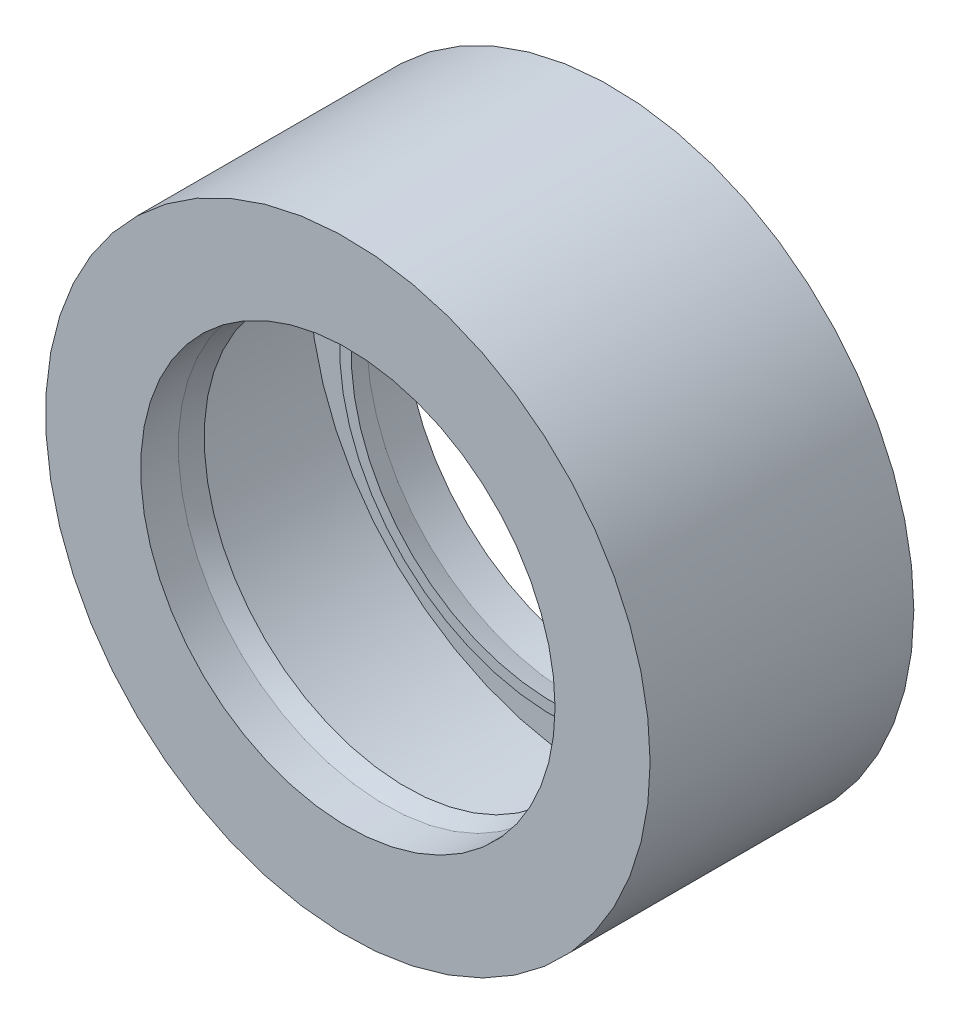
ISO-10303-21;
HEADER;
FILE_DESCRIPTION(('STEP AP214'),'2;1');
FILE_NAME('part.step','',(''),(''),'','','');
FILE_SCHEMA(('AUTOMOTIVE_DESIGN { 1 0 10303 214 1 1 1 1 }'));
ENDSEC;
DATA;
#1=APPLICATION_CONTEXT('core data for automotive mechanical design processes');
#2=APPLICATION_PROTOCOL_DEFINITION('international standard','automotive_design',2000,#1);
#3=PRODUCT_CONTEXT('',#1,'mechanical');
#4=PRODUCT('Part','Part','',(#3));
#5=PRODUCT_RELATED_PRODUCT_CATEGORY('part','',(#4));
#6=PRODUCT_DEFINITION_FORMATION('','',#4);
#7=PRODUCT_DEFINITION_CONTEXT('part definition',#1,'design');
#8=PRODUCT_DEFINITION('design','',#6,#7);
#9=PRODUCT_DEFINITION_SHAPE('','',#8);
#10=(LENGTH_UNIT() NAMED_UNIT(*) SI_UNIT(.MILLI.,.METRE.));
#11=(NAMED_UNIT(*) PLANE_ANGLE_UNIT() SI_UNIT($,.RADIAN.));
#12=(NAMED_UNIT(*) SI_UNIT($,.STERADIAN.) SOLID_ANGLE_UNIT());
#13=UNCERTAINTY_MEASURE_WITH_UNIT(LENGTH_MEASURE(1.E-05),#10,'distance_accuracy_value','');
#14=(GEOMETRIC_REPRESENTATION_CONTEXT(3) GLOBAL_UNCERTAINTY_ASSIGNED_CONTEXT((#13)) GLOBAL_UNIT_ASSIGNED_CONTEXT((#10,
#11,#12)) REPRESENTATION_CONTEXT('',''));
#15=CARTESIAN_POINT('',(0.,0.,0.));
#16=DIRECTION('',(0.,0.,1.));
#17=DIRECTION('',(1.,0.,0.));
#18=AXIS2_PLACEMENT_3D('',#15,#16,#17);
#19=CARTESIAN_POINT('',(0.,55.,0.));
#20=DIRECTION('',(0.,0.,-1.));
#21=DIRECTION('',(-1.,0.,0.));
#22=AXIS2_PLACEMENT_3D('',#19,#20,#21);
#23=PLANE('',#22);
#24=CARTESIAN_POINT('',(0.,0.,0.));
#25=DIRECTION('',(0.,0.,1.));
#26=DIRECTION('',(1.,0.,0.));
#27=AXIS2_PLACEMENT_3D('',#24,#25,#26);
#28=CIRCLE('',#27,55.);
#29=CARTESIAN_POINT('',(55.,0.,0.));
#30=VERTEX_POINT('',#29);
#31=EDGE_CURVE('E83',#30,#30,#28,.T.);
#32=ORIENTED_EDGE('',*,*,#31,.F.);
#33=EDGE_LOOP('',(#32));
#34=FACE_BOUND('',#33,.T.);
#35=CARTESIAN_POINT('',(0.,0.,0.));
#36=DIRECTION('',(0.,0.,1.));
#37=DIRECTION('',(1.,0.,0.));
#38=AXIS2_PLACEMENT_3D('',#35,#36,#37);
#39=CIRCLE('',#38,80.2399325337602);
#40=CARTESIAN_POINT('',(80.2399325337602,0.,0.));
#41=VERTEX_POINT('',#40);
#42=EDGE_CURVE('E10',#41,#41,#39,.T.);
#43=ORIENTED_EDGE('',*,*,#42,.T.);
#44=EDGE_LOOP('',(#43));
#45=FACE_BOUND('',#44,.T.);
#46=ADVANCED_FACE('F31',(#34,#45),#23,.F.);
#47=CARTESIAN_POINT('',(0.,0.,0.));
#48=DIRECTION('',(0.,0.,1.));
#49=DIRECTION('',(1.,0.,0.));
#50=AXIS2_PLACEMENT_3D('',#47,#48,#49);
#51=CYLINDRICAL_SURFACE('',#50,80.2399325337602);
#52=ORIENTED_EDGE('',*,*,#42,.F.);
#53=EDGE_LOOP('',(#52));
#54=FACE_BOUND('',#53,.T.);
#55=CARTESIAN_POINT('',(0.,0.,-70.));
#56=DIRECTION('',(0.,0.,1.));
#57=DIRECTION('',(1.,0.,0.));
#58=AXIS2_PLACEMENT_3D('',#55,#56,#57);
#59=CIRCLE('',#58,80.2399325337602);
#60=CARTESIAN_POINT('',(80.2399325337602,0.,-70.));
#61=VERTEX_POINT('',#60);
#62=EDGE_CURVE('E37',#61,#61,#59,.T.);
#63=ORIENTED_EDGE('',*,*,#62,.T.);
#64=EDGE_LOOP('',(#63));
#65=FACE_BOUND('',#64,.T.);
#66=ADVANCED_FACE('F90',(#54,#65),#51,.T.);
#67=CARTESIAN_POINT('',(0.,55.,-70.));
#68=DIRECTION('',(0.,0.,1.));
#69=DIRECTION('',(1.,0.,0.));
#70=AXIS2_PLACEMENT_3D('',#67,#68,#69);
#71=PLANE('',#70);
#72=ORIENTED_EDGE('',*,*,#62,.F.);
#73=EDGE_LOOP('',(#72));
#74=FACE_BOUND('',#73,.T.);
#75=CARTESIAN_POINT('',(0.,0.,-70.));
#76=DIRECTION('',(0.,0.,1.));
#77=DIRECTION('',(1.,0.,0.));
#78=AXIS2_PLACEMENT_3D('',#75,#76,#77);
#79=CIRCLE('',#78,55.);
#80=CARTESIAN_POINT('',(55.,0.,-70.));
#81=VERTEX_POINT('',#80);
#82=EDGE_CURVE('E41',#81,#81,#79,.T.);
#83=ORIENTED_EDGE('',*,*,#82,.T.);
#84=EDGE_LOOP('',(#83));
#85=FACE_BOUND('',#84,.T.);
#86=ADVANCED_FACE('F94',(#74,#85),#71,.F.);
#87=CARTESIAN_POINT('',(0.,0.,0.));
#88=DIRECTION('',(0.,0.,1.));
#89=DIRECTION('',(1.,0.,0.));
#90=AXIS2_PLACEMENT_3D('',#87,#88,#89);
#91=CYLINDRICAL_SURFACE('',#90,55.);
#92=ORIENTED_EDGE('',*,*,#82,.F.);
#93=EDGE_LOOP('',(#92));
#94=FACE_BOUND('',#93,.T.);
#95=CARTESIAN_POINT('',(0.,0.,-60.));
#96=DIRECTION('',(0.,0.,1.));
#97=DIRECTION('',(1.,0.,0.));
#98=AXIS2_PLACEMENT_3D('',#95,#96,#97);
#99=CIRCLE('',#98,55.);
#100=CARTESIAN_POINT('',(55.,0.,-60.));
#101=VERTEX_POINT('',#100);
#102=EDGE_CURVE('E45',#101,#101,#99,.T.);
#103=ORIENTED_EDGE('',*,*,#102,.T.);
#104=EDGE_LOOP('',(#103));
#105=FACE_BOUND('',#104,.T.);
#106=ADVANCED_FACE('F99',(#94,#105),#91,.F.);
#107=CARTESIAN_POINT('',(0.,0.,-17.366416788586));
#108=DIRECTION('',(0.,0.,1.));
#109=DIRECTION('',(1.,0.,0.));
#110=AXIS2_PLACEMENT_3D('',#107,#108,#109);
#111=TOROIDAL_SURFACE('',#110,215.44862546768,166.01621556918);
#112=ORIENTED_EDGE('',*,*,#102,.F.);
#113=EDGE_LOOP('',(#112));
#114=FACE_BOUND('',#113,.T.);
#115=CARTESIAN_POINT('',(0.,0.,-54.4973549464844));
#116=DIRECTION('',(0.,0.,1.));
#117=DIRECTION('',(1.,0.,0.));
#118=AXIS2_PLACEMENT_3D('',#115,#116,#117);
#119=CIRCLE('',#118,53.6380038650586);
#120=CARTESIAN_POINT('',(53.6380038650586,0.,-54.4973549464844));
#121=VERTEX_POINT('',#120);
#122=EDGE_CURVE('E50',#121,#121,#119,.T.);
#123=ORIENTED_EDGE('',*,*,#122,.T.);
#124=EDGE_LOOP('',(#123));
#125=FACE_BOUND('',#124,.T.);
#126=ADVANCED_FACE('F105',(#114,#125),#111,.T.);
#127=CARTESIAN_POINT('',(0.,56.7174692001984,-54.4973549464845));
#128=DIRECTION('',(0.,0.,-1.));
#129=DIRECTION('',(-1.,0.,0.));
#130=AXIS2_PLACEMENT_3D('',#127,#128,#129);
#131=PLANE('',#130);
#132=ORIENTED_EDGE('',*,*,#122,.F.);
#133=EDGE_LOOP('',(#132));
#134=FACE_BOUND('',#133,.T.);
#135=CARTESIAN_POINT('',(0.,0.,-54.4973549464845));
#136=DIRECTION('',(0.,0.,1.));
#137=DIRECTION('',(1.,0.,0.));
#138=AXIS2_PLACEMENT_3D('',#135,#136,#137);
#139=CIRCLE('',#138,56.7174692001984);
#140=CARTESIAN_POINT('',(56.7174692001984,0.,-54.4973549464845));
#141=VERTEX_POINT('',#140);
#142=EDGE_CURVE('E53',#141,#141,#139,.T.);
#143=ORIENTED_EDGE('',*,*,#142,.T.);
#144=EDGE_LOOP('',(#143));
#145=FACE_BOUND('',#144,.T.);
#146=ADVANCED_FACE('F109',(#134,#145),#131,.F.);
#147=CARTESIAN_POINT('',(0.,0.,-17.366416788586));
#148=DIRECTION('',(0.,0.,1.));
#149=DIRECTION('',(1.,0.,0.));
#150=AXIS2_PLACEMENT_3D('',#147,#148,#149);
#151=TOROIDAL_SURFACE('',#150,215.44862546768,163.01621556918);
#152=ORIENTED_EDGE('',*,*,#142,.F.);
#153=EDGE_LOOP('',(#152));
#154=FACE_BOUND('',#153,.T.);
#155=CARTESIAN_POINT('',(0.,0.,-59.6064082284001));
#156=DIRECTION('',(0.,0.,1.));
#157=DIRECTION('',(1.,0.,0.));
#158=AXIS2_PLACEMENT_3D('',#155,#156,#157);
#159=CIRCLE('',#158,58.);
#160=CARTESIAN_POINT('',(58.,0.,-59.6064082284001));
#161=VERTEX_POINT('',#160);
#162=EDGE_CURVE('E56',#161,#161,#159,.T.);
#163=ORIENTED_EDGE('',*,*,#162,.T.);
#164=EDGE_LOOP('',(#163));
#165=FACE_BOUND('',#164,.T.);
#166=ADVANCED_FACE('F113',(#154,#165),#151,.F.);
#167=CARTESIAN_POINT('',(0.,0.,0.));
#168=DIRECTION('',(0.,0.,1.));
#169=DIRECTION('',(1.,0.,0.));
#170=AXIS2_PLACEMENT_3D('',#167,#168,#169);
#171=CYLINDRICAL_SURFACE('',#170,58.);
#172=ORIENTED_EDGE('',*,*,#162,.F.);
#173=EDGE_LOOP('',(#172));
#174=FACE_BOUND('',#173,.T.);
#175=CARTESIAN_POINT('',(0.,0.,-67.));
#176=DIRECTION('',(0.,0.,1.));
#177=DIRECTION('',(1.,0.,0.));
#178=AXIS2_PLACEMENT_3D('',#175,#176,#177);
#179=CIRCLE('',#178,58.);
#180=CARTESIAN_POINT('',(58.,0.,-67.));
#181=VERTEX_POINT('',#180);
#182=EDGE_CURVE('E59',#181,#181,#179,.T.);
#183=ORIENTED_EDGE('',*,*,#182,.T.);
#184=EDGE_LOOP('',(#183));
#185=FACE_BOUND('',#184,.T.);
#186=ADVANCED_FACE('F117',(#174,#185),#171,.T.);
#187=CARTESIAN_POINT('',(0.,58.,-67.));
#188=DIRECTION('',(0.,0.,-1.));
#189=DIRECTION('',(-1.,0.,0.));
#190=AXIS2_PLACEMENT_3D('',#187,#188,#189);
#191=PLANE('',#190);
#192=ORIENTED_EDGE('',*,*,#182,.F.);
#193=EDGE_LOOP('',(#192));
#194=FACE_BOUND('',#193,.T.);
#195=CARTESIAN_POINT('',(0.,0.,-67.));
#196=DIRECTION('',(0.,0.,1.));
#197=DIRECTION('',(1.,0.,0.));
#198=AXIS2_PLACEMENT_3D('',#195,#196,#197);
#199=CIRCLE('',#198,77.2399325337602);
#200=CARTESIAN_POINT('',(77.2399325337602,0.,-67.));
#201=VERTEX_POINT('',#200);
#202=EDGE_CURVE('E62',#201,#201,#199,.T.);
#203=ORIENTED_EDGE('',*,*,#202,.T.);
#204=EDGE_LOOP('',(#203));
#205=FACE_BOUND('',#204,.T.);
#206=ADVANCED_FACE('F121',(#194,#205),#191,.F.);
#207=CARTESIAN_POINT('',(0.,0.,0.));
#208=DIRECTION('',(0.,0.,1.));
#209=DIRECTION('',(1.,0.,0.));
#210=AXIS2_PLACEMENT_3D('',#207,#208,#209);
#211=CYLINDRICAL_SURFACE('',#210,77.2399325337602);
#212=ORIENTED_EDGE('',*,*,#202,.F.);
#213=EDGE_LOOP('',(#212));
#214=FACE_BOUND('',#213,.T.);
#215=CARTESIAN_POINT('',(0.,0.,-3.));
#216=DIRECTION('',(0.,0.,1.));
#217=DIRECTION('',(1.,0.,0.));
#218=AXIS2_PLACEMENT_3D('',#215,#216,#217);
#219=CIRCLE('',#218,77.2399325337602);
#220=CARTESIAN_POINT('',(77.2399325337602,0.,-3.));
#221=VERTEX_POINT('',#220);
#222=EDGE_CURVE('E65',#221,#221,#219,.T.);
#223=ORIENTED_EDGE('',*,*,#222,.T.);
#224=EDGE_LOOP('',(#223));
#225=FACE_BOUND('',#224,.T.);
#226=ADVANCED_FACE('F125',(#214,#225),#211,.F.);
#227=CARTESIAN_POINT('',(0.,58.,-3.));
#228=DIRECTION('',(0.,0.,1.));
#229=DIRECTION('',(1.,0.,0.));
#230=AXIS2_PLACEMENT_3D('',#227,#228,#229);
#231=PLANE('',#230);
#232=ORIENTED_EDGE('',*,*,#222,.F.);
#233=EDGE_LOOP('',(#232));
#234=FACE_BOUND('',#233,.T.);
#235=CARTESIAN_POINT('',(0.,0.,-3.));
#236=DIRECTION('',(0.,0.,1.));
#237=DIRECTION('',(1.,0.,0.));
#238=AXIS2_PLACEMENT_3D('',#235,#236,#237);
#239=CIRCLE('',#238,58.);
#240=CARTESIAN_POINT('',(58.,0.,-3.));
#241=VERTEX_POINT('',#240);
#242=EDGE_CURVE('E68',#241,#241,#239,.T.);
#243=ORIENTED_EDGE('',*,*,#242,.T.);
#244=EDGE_LOOP('',(#243));
#245=FACE_BOUND('',#244,.T.);
#246=ADVANCED_FACE('F129',(#234,#245),#231,.F.);
#247=CARTESIAN_POINT('',(0.,0.,0.));
#248=DIRECTION('',(0.,0.,1.));
#249=DIRECTION('',(1.,0.,0.));
#250=AXIS2_PLACEMENT_3D('',#247,#248,#249);
#251=CYLINDRICAL_SURFACE('',#250,58.);
#252=ORIENTED_EDGE('',*,*,#242,.F.);
#253=EDGE_LOOP('',(#252));
#254=FACE_BOUND('',#253,.T.);
#255=CARTESIAN_POINT('',(0.,0.,-10.3935917716));
#256=DIRECTION('',(0.,0.,1.));
#257=DIRECTION('',(1.,0.,0.));
#258=AXIS2_PLACEMENT_3D('',#255,#256,#257);
#259=CIRCLE('',#258,58.);
#260=CARTESIAN_POINT('',(58.,0.,-10.3935917716));
#261=VERTEX_POINT('',#260);
#262=EDGE_CURVE('E71',#261,#261,#259,.T.);
#263=ORIENTED_EDGE('',*,*,#262,.T.);
#264=EDGE_LOOP('',(#263));
#265=FACE_BOUND('',#264,.T.);
#266=ADVANCED_FACE('F133',(#254,#265),#251,.T.);
#267=CARTESIAN_POINT('',(0.,0.,-52.633583211414));
#268=DIRECTION('',(0.,0.,1.));
#269=DIRECTION('',(1.,0.,0.));
#270=AXIS2_PLACEMENT_3D('',#267,#268,#269);
#271=TOROIDAL_SURFACE('',#270,215.44862546768,163.01621556918);
#272=ORIENTED_EDGE('',*,*,#262,.F.);
#273=EDGE_LOOP('',(#272));
#274=FACE_BOUND('',#273,.T.);
#275=CARTESIAN_POINT('',(0.,0.,-15.5026450535156));
#276=DIRECTION('',(0.,0.,1.));
#277=DIRECTION('',(1.,0.,0.));
#278=AXIS2_PLACEMENT_3D('',#275,#276,#277);
#279=CIRCLE('',#278,56.7174692001984);
#280=CARTESIAN_POINT('',(56.7174692001984,0.,-15.5026450535156));
#281=VERTEX_POINT('',#280);
#282=EDGE_CURVE('E74',#281,#281,#279,.T.);
#283=ORIENTED_EDGE('',*,*,#282,.T.);
#284=EDGE_LOOP('',(#283));
#285=FACE_BOUND('',#284,.T.);
#286=ADVANCED_FACE('F137',(#274,#285),#271,.F.);
#287=CARTESIAN_POINT('',(0.,56.7174692001984,-15.5026450535156));
#288=DIRECTION('',(0.,0.,1.));
#289=DIRECTION('',(1.,0.,0.));
#290=AXIS2_PLACEMENT_3D('',#287,#288,#289);
#291=PLANE('',#290);
#292=ORIENTED_EDGE('',*,*,#282,.F.);
#293=EDGE_LOOP('',(#292));
#294=FACE_BOUND('',#293,.T.);
#295=CARTESIAN_POINT('',(0.,0.,-15.5026450535156));
#296=DIRECTION('',(0.,0.,1.));
#297=DIRECTION('',(1.,0.,0.));
#298=AXIS2_PLACEMENT_3D('',#295,#296,#297);
#299=CIRCLE('',#298,53.6380038650586);
#300=CARTESIAN_POINT('',(53.6380038650586,0.,-15.5026450535156));
#301=VERTEX_POINT('',#300);
#302=EDGE_CURVE('E77',#301,#301,#299,.T.);
#303=ORIENTED_EDGE('',*,*,#302,.T.);
#304=EDGE_LOOP('',(#303));
#305=FACE_BOUND('',#304,.T.);
#306=ADVANCED_FACE('F141',(#294,#305),#291,.F.);
#307=CARTESIAN_POINT('',(0.,0.,-52.633583211414));
#308=DIRECTION('',(0.,0.,1.));
#309=DIRECTION('',(1.,0.,0.));
#310=AXIS2_PLACEMENT_3D('',#307,#308,#309);
#311=TOROIDAL_SURFACE('',#310,215.44862546768,166.01621556918);
#312=ORIENTED_EDGE('',*,*,#302,.F.);
#313=EDGE_LOOP('',(#312));
#314=FACE_BOUND('',#313,.T.);
#315=CARTESIAN_POINT('',(0.,0.,-10.));
#316=DIRECTION('',(0.,0.,1.));
#317=DIRECTION('',(1.,0.,0.));
#318=AXIS2_PLACEMENT_3D('',#315,#316,#317);
#319=CIRCLE('',#318,55.);
#320=CARTESIAN_POINT('',(55.,0.,-10.));
#321=VERTEX_POINT('',#320);
#322=EDGE_CURVE('E80',#321,#321,#319,.T.);
#323=ORIENTED_EDGE('',*,*,#322,.T.);
#324=EDGE_LOOP('',(#323));
#325=FACE_BOUND('',#324,.T.);
#326=ADVANCED_FACE('F145',(#314,#325),#311,.T.);
#327=CARTESIAN_POINT('',(0.,0.,0.));
#328=DIRECTION('',(0.,0.,1.));
#329=DIRECTION('',(1.,0.,0.));
#330=AXIS2_PLACEMENT_3D('',#327,#328,#329);
#331=CYLINDRICAL_SURFACE('',#330,55.);
#332=ORIENTED_EDGE('',*,*,#322,.F.);
#333=EDGE_LOOP('',(#332));
#334=FACE_BOUND('',#333,.T.);
#335=ORIENTED_EDGE('',*,*,#31,.T.);
#336=EDGE_LOOP('',(#335));
#337=FACE_BOUND('',#336,.T.);
#338=ADVANCED_FACE('F87',(#334,#337),#331,.F.);
#339=CLOSED_SHELL('',(#46,#66,#86,#106,#126,#146,#166,#186,#206,#226,#246,#266,#286,#306,#326,#338));
#340=MANIFOLD_SOLID_BREP('B2',#339);
#341=ADVANCED_BREP_SHAPE_REPRESENTATION('',(#18,#340),#14);
#342=SHAPE_DEFINITION_REPRESENTATION(#9,#341);
ENDSEC;
END-ISO-10303-21;
